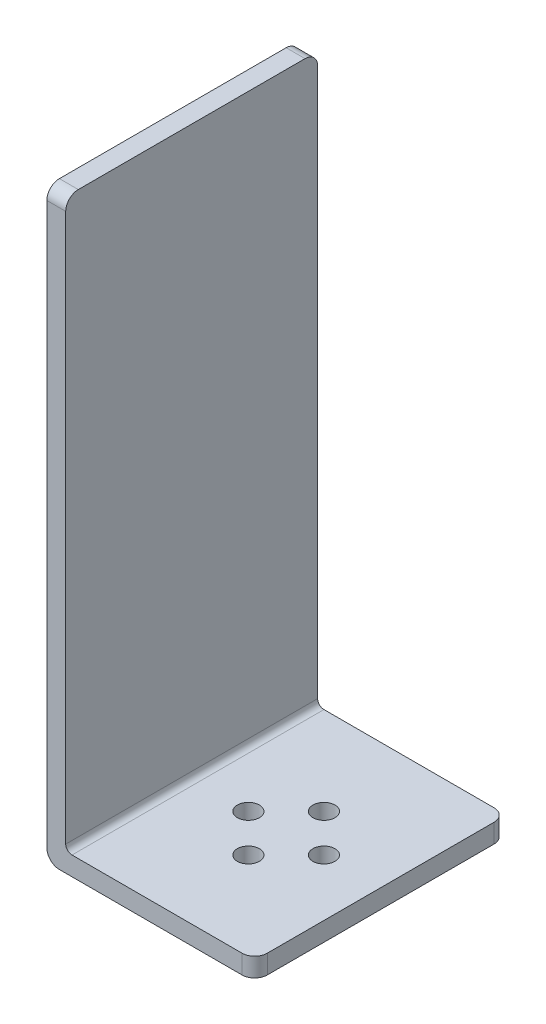
ISO-10303-21;
HEADER;
FILE_DESCRIPTION(('STEP AP214'),'2;1');
FILE_NAME('part.step','',(''),(''),'','','');
FILE_SCHEMA(('AUTOMOTIVE_DESIGN { 1 0 10303 214 1 1 1 1 }'));
ENDSEC;
DATA;
#1=APPLICATION_CONTEXT('core data for automotive mechanical design processes');
#2=APPLICATION_PROTOCOL_DEFINITION('international standard','automotive_design',2000,#1);
#3=PRODUCT_CONTEXT('',#1,'mechanical');
#4=PRODUCT('Part','Part','',(#3));
#5=PRODUCT_RELATED_PRODUCT_CATEGORY('part','',(#4));
#6=PRODUCT_DEFINITION_FORMATION('','',#4);
#7=PRODUCT_DEFINITION_CONTEXT('part definition',#1,'design');
#8=PRODUCT_DEFINITION('design','',#6,#7);
#9=PRODUCT_DEFINITION_SHAPE('','',#8);
#10=(LENGTH_UNIT() NAMED_UNIT(*) SI_UNIT(.MILLI.,.METRE.));
#11=(NAMED_UNIT(*) PLANE_ANGLE_UNIT() SI_UNIT($,.RADIAN.));
#12=(NAMED_UNIT(*) SI_UNIT($,.STERADIAN.) SOLID_ANGLE_UNIT());
#13=UNCERTAINTY_MEASURE_WITH_UNIT(LENGTH_MEASURE(1.E-05),#10,'distance_accuracy_value','');
#14=(GEOMETRIC_REPRESENTATION_CONTEXT(3) GLOBAL_UNCERTAINTY_ASSIGNED_CONTEXT((#13)) GLOBAL_UNIT_ASSIGNED_CONTEXT((#10,
#11,#12)) REPRESENTATION_CONTEXT('',''));
#15=CARTESIAN_POINT('',(0.,0.,0.));
#16=DIRECTION('',(0.,0.,1.));
#17=DIRECTION('',(1.,0.,0.));
#18=AXIS2_PLACEMENT_3D('',#15,#16,#17);
#19=CARTESIAN_POINT('',(0.,-3.,40.));
#20=DIRECTION('',(0.,1.,0.));
#21=DIRECTION('',(0.,0.,1.));
#22=AXIS2_PLACEMENT_3D('',#19,#20,#21);
#23=PLANE('',#22);
#24=CARTESIAN_POINT('',(9.,-3.,20.));
#25=DIRECTION('',(0.,1.,0.));
#26=DIRECTION('',(0.,0.,1.));
#27=AXIS2_PLACEMENT_3D('',#24,#25,#26);
#28=CIRCLE('',#27,1.75);
#29=CARTESIAN_POINT('',(9.,-3.,21.75));
#30=VERTEX_POINT('',#29);
#31=EDGE_CURVE('E299',#30,#30,#28,.T.);
#32=ORIENTED_EDGE('',*,*,#31,.T.);
#33=EDGE_LOOP('',(#32));
#34=FACE_BOUND('',#33,.T.);
#35=CARTESIAN_POINT('',(21.,-3.,20.));
#36=DIRECTION('',(0.,1.,0.));
#37=DIRECTION('',(0.,0.,1.));
#38=AXIS2_PLACEMENT_3D('',#35,#36,#37);
#39=CIRCLE('',#38,1.74999999999999);
#40=CARTESIAN_POINT('',(21.,-3.,21.75));
#41=VERTEX_POINT('',#40);
#42=EDGE_CURVE('E293',#41,#41,#39,.T.);
#43=ORIENTED_EDGE('',*,*,#42,.T.);
#44=EDGE_LOOP('',(#43));
#45=FACE_BOUND('',#44,.T.);
#46=CARTESIAN_POINT('',(15.,-3.,26.));
#47=DIRECTION('',(0.,1.,0.));
#48=DIRECTION('',(0.,0.,1.));
#49=AXIS2_PLACEMENT_3D('',#46,#47,#48);
#50=CIRCLE('',#49,1.74999999999999);
#51=CARTESIAN_POINT('',(15.,-3.,27.75));
#52=VERTEX_POINT('',#51);
#53=EDGE_CURVE('E287',#52,#52,#50,.T.);
#54=ORIENTED_EDGE('',*,*,#53,.T.);
#55=EDGE_LOOP('',(#54));
#56=FACE_BOUND('',#55,.T.);
#57=CARTESIAN_POINT('',(15.,-3.,14.));
#58=DIRECTION('',(0.,1.,0.));
#59=DIRECTION('',(0.,0.,1.));
#60=AXIS2_PLACEMENT_3D('',#57,#58,#59);
#61=CIRCLE('',#60,1.75);
#62=CARTESIAN_POINT('',(15.,-3.,15.75));
#63=VERTEX_POINT('',#62);
#64=EDGE_CURVE('E203',#63,#63,#61,.T.);
#65=ORIENTED_EDGE('',*,*,#64,.T.);
#66=EDGE_LOOP('',(#65));
#67=FACE_BOUND('',#66,.T.);
#68=DIRECTION('',(1.,0.,0.));
#69=VECTOR('',#68,1.);
#70=CARTESIAN_POINT('',(0.,-3.,0.));
#71=LINE('',#70,#69);
#72=CARTESIAN_POINT('',(-1.,-3.,0.));
#73=VERTEX_POINT('',#72);
#74=CARTESIAN_POINT('',(28.,-3.,0.));
#75=VERTEX_POINT('',#74);
#76=EDGE_CURVE('E198',#73,#75,#71,.T.);
#77=ORIENTED_EDGE('',*,*,#76,.T.);
#78=CARTESIAN_POINT('',(28.,-3.,2.));
#79=DIRECTION('',(0.,1.,0.));
#80=DIRECTION('',(0.,0.,1.));
#81=AXIS2_PLACEMENT_3D('',#78,#79,#80);
#82=CIRCLE('',#81,2.);
#83=CARTESIAN_POINT('',(30.,-3.,2.));
#84=VERTEX_POINT('',#83);
#85=EDGE_CURVE('E55',#75,#84,#82,.F.);
#86=ORIENTED_EDGE('',*,*,#85,.T.);
#87=DIRECTION('',(0.,0.,-1.));
#88=VECTOR('',#87,1.);
#89=CARTESIAN_POINT('',(30.,-3.,40.));
#90=LINE('',#89,#88);
#91=CARTESIAN_POINT('',(30.,-3.,38.));
#92=VERTEX_POINT('',#91);
#93=EDGE_CURVE('E149',#92,#84,#90,.T.);
#94=ORIENTED_EDGE('',*,*,#93,.F.);
#95=CARTESIAN_POINT('',(28.,-3.,38.));
#96=DIRECTION('',(0.,1.,0.));
#97=DIRECTION('',(0.,0.,1.));
#98=AXIS2_PLACEMENT_3D('',#95,#96,#97);
#99=CIRCLE('',#98,2.);
#100=CARTESIAN_POINT('',(28.,-3.,40.));
#101=VERTEX_POINT('',#100);
#102=EDGE_CURVE('E187',#92,#101,#99,.F.);
#103=ORIENTED_EDGE('',*,*,#102,.T.);
#104=DIRECTION('',(1.,0.,0.));
#105=VECTOR('',#104,1.);
#106=CARTESIAN_POINT('',(0.,-3.,40.));
#107=LINE('',#106,#105);
#108=CARTESIAN_POINT('',(-1.,-3.,40.));
#109=VERTEX_POINT('',#108);
#110=EDGE_CURVE('E214',#109,#101,#107,.T.);
#111=ORIENTED_EDGE('',*,*,#110,.F.);
#112=DIRECTION('',(0.,0.,-1.));
#113=VECTOR('',#112,1.);
#114=CARTESIAN_POINT('',(-1.,-3.,40.));
#115=LINE('',#114,#113);
#116=EDGE_CURVE('E157',#109,#73,#115,.T.);
#117=ORIENTED_EDGE('',*,*,#116,.T.);
#118=EDGE_LOOP('',(#77,#86,#94,#103,#111,#117));
#119=FACE_BOUND('',#118,.T.);
#120=ADVANCED_FACE('F33',(#34,#45,#56,#67,#119),#23,.F.);
#121=CARTESIAN_POINT('',(30.,0.,40.));
#122=DIRECTION('',(1.,0.,0.));
#123=DIRECTION('',(0.,0.,-1.));
#124=AXIS2_PLACEMENT_3D('',#121,#122,#123);
#125=PLANE('',#124);
#126=ORIENTED_EDGE('',*,*,#93,.T.);
#127=DIRECTION('',(0.,-1.,0.));
#128=VECTOR('',#127,1.);
#129=CARTESIAN_POINT('',(30.,0.,2.));
#130=LINE('',#129,#128);
#131=CARTESIAN_POINT('',(30.,0.,2.));
#132=VERTEX_POINT('',#131);
#133=EDGE_CURVE('E41',#84,#132,#130,.F.);
#134=ORIENTED_EDGE('',*,*,#133,.T.);
#135=DIRECTION('',(0.,0.,-1.));
#136=VECTOR('',#135,1.);
#137=CARTESIAN_POINT('',(30.,0.,40.));
#138=LINE('',#137,#136);
#139=CARTESIAN_POINT('',(30.,0.,38.));
#140=VERTEX_POINT('',#139);
#141=EDGE_CURVE('E152',#140,#132,#138,.T.);
#142=ORIENTED_EDGE('',*,*,#141,.F.);
#143=DIRECTION('',(0.,-1.,0.));
#144=VECTOR('',#143,1.);
#145=CARTESIAN_POINT('',(30.,-3.,38.));
#146=LINE('',#145,#144);
#147=EDGE_CURVE('E184',#140,#92,#146,.T.);
#148=ORIENTED_EDGE('',*,*,#147,.T.);
#149=EDGE_LOOP('',(#126,#134,#142,#148));
#150=FACE_BOUND('',#149,.T.);
#151=ADVANCED_FACE('F238',(#150),#125,.T.);
#152=CARTESIAN_POINT('',(0.,0.,40.));
#153=DIRECTION('',(0.,1.,0.));
#154=DIRECTION('',(0.,0.,1.));
#155=AXIS2_PLACEMENT_3D('',#152,#153,#154);
#156=PLANE('',#155);
#157=CARTESIAN_POINT('',(9.,0.,20.));
#158=DIRECTION('',(0.,1.,0.));
#159=DIRECTION('',(0.,0.,1.));
#160=AXIS2_PLACEMENT_3D('',#157,#158,#159);
#161=CIRCLE('',#160,1.75);
#162=CARTESIAN_POINT('',(9.,0.,21.75));
#163=VERTEX_POINT('',#162);
#164=EDGE_CURVE('E301',#163,#163,#161,.T.);
#165=ORIENTED_EDGE('',*,*,#164,.F.);
#166=EDGE_LOOP('',(#165));
#167=FACE_BOUND('',#166,.T.);
#168=CARTESIAN_POINT('',(21.,0.,20.));
#169=DIRECTION('',(0.,1.,0.));
#170=DIRECTION('',(0.,0.,1.));
#171=AXIS2_PLACEMENT_3D('',#168,#169,#170);
#172=CIRCLE('',#171,1.74999999999999);
#173=CARTESIAN_POINT('',(21.,0.,21.75));
#174=VERTEX_POINT('',#173);
#175=EDGE_CURVE('E296',#174,#174,#172,.T.);
#176=ORIENTED_EDGE('',*,*,#175,.F.);
#177=EDGE_LOOP('',(#176));
#178=FACE_BOUND('',#177,.T.);
#179=CARTESIAN_POINT('',(15.,0.,26.));
#180=DIRECTION('',(0.,1.,0.));
#181=DIRECTION('',(0.,0.,1.));
#182=AXIS2_PLACEMENT_3D('',#179,#180,#181);
#183=CIRCLE('',#182,1.74999999999999);
#184=CARTESIAN_POINT('',(15.,0.,27.75));
#185=VERTEX_POINT('',#184);
#186=EDGE_CURVE('E290',#185,#185,#183,.T.);
#187=ORIENTED_EDGE('',*,*,#186,.F.);
#188=EDGE_LOOP('',(#187));
#189=FACE_BOUND('',#188,.T.);
#190=CARTESIAN_POINT('',(15.,0.,14.));
#191=DIRECTION('',(0.,1.,0.));
#192=DIRECTION('',(0.,0.,1.));
#193=AXIS2_PLACEMENT_3D('',#190,#191,#192);
#194=CIRCLE('',#193,1.75);
#195=CARTESIAN_POINT('',(15.,0.,15.75));
#196=VERTEX_POINT('',#195);
#197=EDGE_CURVE('E207',#196,#196,#194,.T.);
#198=ORIENTED_EDGE('',*,*,#197,.F.);
#199=EDGE_LOOP('',(#198));
#200=FACE_BOUND('',#199,.T.);
#201=ORIENTED_EDGE('',*,*,#141,.T.);
#202=CARTESIAN_POINT('',(28.,0.,2.));
#203=DIRECTION('',(0.,1.,0.));
#204=DIRECTION('',(0.,0.,1.));
#205=AXIS2_PLACEMENT_3D('',#202,#203,#204);
#206=CIRCLE('',#205,2.);
#207=CARTESIAN_POINT('',(28.,0.,0.));
#208=VERTEX_POINT('',#207);
#209=EDGE_CURVE('E11',#132,#208,#206,.T.);
#210=ORIENTED_EDGE('',*,*,#209,.T.);
#211=DIRECTION('',(1.,0.,0.));
#212=VECTOR('',#211,1.);
#213=CARTESIAN_POINT('',(0.,0.,0.));
#214=LINE('',#213,#212);
#215=CARTESIAN_POINT('',(1.,0.,0.));
#216=VERTEX_POINT('',#215);
#217=EDGE_CURVE('E134',#216,#208,#214,.T.);
#218=ORIENTED_EDGE('',*,*,#217,.F.);
#219=DIRECTION('',(0.,0.,-1.));
#220=VECTOR('',#219,1.);
#221=CARTESIAN_POINT('',(1.,0.,40.));
#222=LINE('',#221,#220);
#223=CARTESIAN_POINT('',(1.,0.,40.));
#224=VERTEX_POINT('',#223);
#225=EDGE_CURVE('E142',#216,#224,#222,.F.);
#226=ORIENTED_EDGE('',*,*,#225,.T.);
#227=DIRECTION('',(1.,0.,0.));
#228=VECTOR('',#227,1.);
#229=CARTESIAN_POINT('',(0.,0.,40.));
#230=LINE('',#229,#228);
#231=CARTESIAN_POINT('',(28.,0.,40.));
#232=VERTEX_POINT('',#231);
#233=EDGE_CURVE('E281',#224,#232,#230,.T.);
#234=ORIENTED_EDGE('',*,*,#233,.T.);
#235=CARTESIAN_POINT('',(28.,0.,38.));
#236=DIRECTION('',(0.,1.,0.));
#237=DIRECTION('',(0.,0.,1.));
#238=AXIS2_PLACEMENT_3D('',#235,#236,#237);
#239=CIRCLE('',#238,2.);
#240=EDGE_CURVE('E191',#232,#140,#239,.T.);
#241=ORIENTED_EDGE('',*,*,#240,.T.);
#242=EDGE_LOOP('',(#201,#210,#218,#226,#234,#241));
#243=FACE_BOUND('',#242,.T.);
#244=ADVANCED_FACE('F221',(#167,#178,#189,#200,#243),#156,.T.);
#245=CARTESIAN_POINT('',(0.,0.,40.));
#246=DIRECTION('',(1.,0.,0.));
#247=DIRECTION('',(0.,0.,-1.));
#248=AXIS2_PLACEMENT_3D('',#245,#246,#247);
#249=PLANE('',#248);
#250=DIRECTION('',(0.,-1.,0.));
#251=VECTOR('',#250,1.);
#252=CARTESIAN_POINT('',(0.,0.,0.));
#253=LINE('',#252,#251);
#254=CARTESIAN_POINT('',(0.,88.,0.));
#255=VERTEX_POINT('',#254);
#256=CARTESIAN_POINT('',(0.,1.,0.));
#257=VERTEX_POINT('',#256);
#258=EDGE_CURVE('E122',#255,#257,#253,.T.);
#259=ORIENTED_EDGE('',*,*,#258,.F.);
#260=CARTESIAN_POINT('',(0.,88.,2.));
#261=DIRECTION('',(1.,0.,0.));
#262=DIRECTION('',(0.,0.,-1.));
#263=AXIS2_PLACEMENT_3D('',#260,#261,#262);
#264=CIRCLE('',#263,2.);
#265=CARTESIAN_POINT('',(0.,90.,2.));
#266=VERTEX_POINT('',#265);
#267=EDGE_CURVE('E178',#255,#266,#264,.T.);
#268=ORIENTED_EDGE('',*,*,#267,.T.);
#269=DIRECTION('',(0.,0.,-1.));
#270=VECTOR('',#269,1.);
#271=CARTESIAN_POINT('',(0.,90.,40.));
#272=LINE('',#271,#270);
#273=CARTESIAN_POINT('',(0.,90.,38.));
#274=VERTEX_POINT('',#273);
#275=EDGE_CURVE('E218',#274,#266,#272,.T.);
#276=ORIENTED_EDGE('',*,*,#275,.F.);
#277=CARTESIAN_POINT('',(0.,88.,38.));
#278=DIRECTION('',(1.,0.,0.));
#279=DIRECTION('',(0.,0.,-1.));
#280=AXIS2_PLACEMENT_3D('',#277,#278,#279);
#281=CIRCLE('',#280,2.);
#282=CARTESIAN_POINT('',(0.,88.,40.));
#283=VERTEX_POINT('',#282);
#284=EDGE_CURVE('E171',#274,#283,#281,.T.);
#285=ORIENTED_EDGE('',*,*,#284,.T.);
#286=DIRECTION('',(0.,-1.,0.));
#287=VECTOR('',#286,1.);
#288=CARTESIAN_POINT('',(0.,0.,40.));
#289=LINE('',#288,#287);
#290=CARTESIAN_POINT('',(0.,1.,40.));
#291=VERTEX_POINT('',#290);
#292=EDGE_CURVE('E147',#283,#291,#289,.T.);
#293=ORIENTED_EDGE('',*,*,#292,.T.);
#294=DIRECTION('',(0.,0.,-1.));
#295=VECTOR('',#294,1.);
#296=CARTESIAN_POINT('',(0.,1.,0.));
#297=LINE('',#296,#295);
#298=EDGE_CURVE('E141',#291,#257,#297,.T.);
#299=ORIENTED_EDGE('',*,*,#298,.T.);
#300=EDGE_LOOP('',(#259,#268,#276,#285,#293,#299));
#301=FACE_BOUND('',#300,.T.);
#302=ADVANCED_FACE('F145',(#301),#249,.T.);
#303=CARTESIAN_POINT('',(-3.,90.,40.));
#304=DIRECTION('',(0.,1.,0.));
#305=DIRECTION('',(0.,0.,1.));
#306=AXIS2_PLACEMENT_3D('',#303,#304,#305);
#307=PLANE('',#306);
#308=ORIENTED_EDGE('',*,*,#275,.T.);
#309=DIRECTION('',(1.,0.,0.));
#310=VECTOR('',#309,1.);
#311=CARTESIAN_POINT('',(-3.,90.,2.));
#312=LINE('',#311,#310);
#313=CARTESIAN_POINT('',(-3.,90.,2.));
#314=VERTEX_POINT('',#313);
#315=EDGE_CURVE('E180',#266,#314,#312,.F.);
#316=ORIENTED_EDGE('',*,*,#315,.T.);
#317=DIRECTION('',(0.,0.,-1.));
#318=VECTOR('',#317,1.);
#319=CARTESIAN_POINT('',(-3.,90.,40.));
#320=LINE('',#319,#318);
#321=CARTESIAN_POINT('',(-3.,90.,38.));
#322=VERTEX_POINT('',#321);
#323=EDGE_CURVE('E215',#322,#314,#320,.T.);
#324=ORIENTED_EDGE('',*,*,#323,.F.);
#325=DIRECTION('',(1.,0.,0.));
#326=VECTOR('',#325,1.);
#327=CARTESIAN_POINT('',(0.,90.,38.));
#328=LINE('',#327,#326);
#329=EDGE_CURVE('E168',#322,#274,#328,.T.);
#330=ORIENTED_EDGE('',*,*,#329,.T.);
#331=EDGE_LOOP('',(#308,#316,#324,#330));
#332=FACE_BOUND('',#331,.T.);
#333=ADVANCED_FACE('F277',(#332),#307,.T.);
#334=CARTESIAN_POINT('',(-3.,0.,40.));
#335=DIRECTION('',(1.,0.,0.));
#336=DIRECTION('',(0.,0.,-1.));
#337=AXIS2_PLACEMENT_3D('',#334,#335,#336);
#338=PLANE('',#337);
#339=ORIENTED_EDGE('',*,*,#323,.T.);
#340=CARTESIAN_POINT('',(-3.,88.,2.));
#341=DIRECTION('',(1.,0.,0.));
#342=DIRECTION('',(0.,0.,-1.));
#343=AXIS2_PLACEMENT_3D('',#340,#341,#342);
#344=CIRCLE('',#343,2.);
#345=CARTESIAN_POINT('',(-3.,88.,0.));
#346=VERTEX_POINT('',#345);
#347=EDGE_CURVE('E182',#314,#346,#344,.F.);
#348=ORIENTED_EDGE('',*,*,#347,.T.);
#349=DIRECTION('',(0.,1.,0.));
#350=VECTOR('',#349,1.);
#351=CARTESIAN_POINT('',(-3.,0.,0.));
#352=LINE('',#351,#350);
#353=CARTESIAN_POINT('',(-3.,-1.,0.));
#354=VERTEX_POINT('',#353);
#355=EDGE_CURVE('E133',#346,#354,#352,.F.);
#356=ORIENTED_EDGE('',*,*,#355,.T.);
#357=DIRECTION('',(0.,0.,-1.));
#358=VECTOR('',#357,1.);
#359=CARTESIAN_POINT('',(-3.,-1.,40.));
#360=LINE('',#359,#358);
#361=CARTESIAN_POINT('',(-3.,-1.,40.));
#362=VERTEX_POINT('',#361);
#363=EDGE_CURVE('E163',#354,#362,#360,.F.);
#364=ORIENTED_EDGE('',*,*,#363,.T.);
#365=DIRECTION('',(0.,1.,0.));
#366=VECTOR('',#365,1.);
#367=CARTESIAN_POINT('',(-3.,0.,40.));
#368=LINE('',#367,#366);
#369=CARTESIAN_POINT('',(-3.,88.,40.));
#370=VERTEX_POINT('',#369);
#371=EDGE_CURVE('E210',#370,#362,#368,.F.);
#372=ORIENTED_EDGE('',*,*,#371,.F.);
#373=CARTESIAN_POINT('',(-3.,88.,38.));
#374=DIRECTION('',(1.,0.,0.));
#375=DIRECTION('',(0.,0.,-1.));
#376=AXIS2_PLACEMENT_3D('',#373,#374,#375);
#377=CIRCLE('',#376,2.);
#378=EDGE_CURVE('E175',#370,#322,#377,.F.);
#379=ORIENTED_EDGE('',*,*,#378,.T.);
#380=EDGE_LOOP('',(#339,#348,#356,#364,#372,#379));
#381=FACE_BOUND('',#380,.T.);
#382=ADVANCED_FACE('F266',(#381),#338,.F.);
#383=CARTESIAN_POINT('',(0.,0.,40.));
#384=DIRECTION('',(0.,0.,-1.));
#385=DIRECTION('',(-1.,0.,0.));
#386=AXIS2_PLACEMENT_3D('',#383,#384,#385);
#387=PLANE('',#386);
#388=ORIENTED_EDGE('',*,*,#110,.T.);
#389=DIRECTION('',(0.,-1.,0.));
#390=VECTOR('',#389,1.);
#391=CARTESIAN_POINT('',(28.,0.,40.));
#392=LINE('',#391,#390);
#393=EDGE_CURVE('E189',#101,#232,#392,.F.);
#394=ORIENTED_EDGE('',*,*,#393,.T.);
#395=ORIENTED_EDGE('',*,*,#233,.F.);
#396=CARTESIAN_POINT('',(1.,1.,40.));
#397=DIRECTION('',(0.,0.,-1.));
#398=DIRECTION('',(-1.,0.,0.));
#399=AXIS2_PLACEMENT_3D('',#396,#397,#398);
#400=CIRCLE('',#399,1.);
#401=EDGE_CURVE('E143',#224,#291,#400,.T.);
#402=ORIENTED_EDGE('',*,*,#401,.T.);
#403=ORIENTED_EDGE('',*,*,#292,.F.);
#404=DIRECTION('',(1.,0.,0.));
#405=VECTOR('',#404,1.);
#406=CARTESIAN_POINT('',(-3.,88.,40.));
#407=LINE('',#406,#405);
#408=EDGE_CURVE('E173',#283,#370,#407,.F.);
#409=ORIENTED_EDGE('',*,*,#408,.T.);
#410=ORIENTED_EDGE('',*,*,#371,.T.);
#411=CARTESIAN_POINT('',(-1.,-1.,40.));
#412=DIRECTION('',(0.,0.,-1.));
#413=DIRECTION('',(-1.,0.,0.));
#414=AXIS2_PLACEMENT_3D('',#411,#412,#413);
#415=CIRCLE('',#414,2.);
#416=EDGE_CURVE('E166',#362,#109,#415,.F.);
#417=ORIENTED_EDGE('',*,*,#416,.T.);
#418=EDGE_LOOP('',(#388,#394,#395,#402,#403,#409,#410,#417));
#419=FACE_BOUND('',#418,.T.);
#420=ADVANCED_FACE('F279',(#419),#387,.F.);
#421=CARTESIAN_POINT('',(0.,0.,0.));
#422=DIRECTION('',(0.,0.,-1.));
#423=DIRECTION('',(-1.,0.,0.));
#424=AXIS2_PLACEMENT_3D('',#421,#422,#423);
#425=PLANE('',#424);
#426=ORIENTED_EDGE('',*,*,#217,.T.);
#427=DIRECTION('',(0.,-1.,0.));
#428=VECTOR('',#427,1.);
#429=CARTESIAN_POINT('',(28.,0.,0.));
#430=LINE('',#429,#428);
#431=EDGE_CURVE('E193',#208,#75,#430,.T.);
#432=ORIENTED_EDGE('',*,*,#431,.T.);
#433=ORIENTED_EDGE('',*,*,#76,.F.);
#434=CARTESIAN_POINT('',(-1.,-1.,0.));
#435=DIRECTION('',(0.,0.,-1.));
#436=DIRECTION('',(-1.,0.,0.));
#437=AXIS2_PLACEMENT_3D('',#434,#435,#436);
#438=CIRCLE('',#437,2.);
#439=EDGE_CURVE('E160',#73,#354,#438,.T.);
#440=ORIENTED_EDGE('',*,*,#439,.T.);
#441=ORIENTED_EDGE('',*,*,#355,.F.);
#442=DIRECTION('',(1.,0.,0.));
#443=VECTOR('',#442,1.);
#444=CARTESIAN_POINT('',(0.,88.,0.));
#445=LINE('',#444,#443);
#446=EDGE_CURVE('E130',#346,#255,#445,.T.);
#447=ORIENTED_EDGE('',*,*,#446,.T.);
#448=ORIENTED_EDGE('',*,*,#258,.T.);
#449=CARTESIAN_POINT('',(1.,1.,0.));
#450=DIRECTION('',(0.,0.,-1.));
#451=DIRECTION('',(-1.,0.,0.));
#452=AXIS2_PLACEMENT_3D('',#449,#450,#451);
#453=CIRCLE('',#452,1.);
#454=EDGE_CURVE('E126',#257,#216,#453,.F.);
#455=ORIENTED_EDGE('',*,*,#454,.T.);
#456=EDGE_LOOP('',(#426,#432,#433,#440,#441,#447,#448,#455));
#457=FACE_BOUND('',#456,.T.);
#458=ADVANCED_FACE('F125',(#457),#425,.T.);
#459=CARTESIAN_POINT('',(1.,1.,40.));
#460=DIRECTION('',(0.,0.,1.));
#461=DIRECTION('',(1.,0.,0.));
#462=AXIS2_PLACEMENT_3D('',#459,#460,#461);
#463=CYLINDRICAL_SURFACE('',#462,1.);
#464=ORIENTED_EDGE('',*,*,#401,.F.);
#465=ORIENTED_EDGE('',*,*,#225,.F.);
#466=ORIENTED_EDGE('',*,*,#454,.F.);
#467=ORIENTED_EDGE('',*,*,#298,.F.);
#468=EDGE_LOOP('',(#464,#465,#466,#467));
#469=FACE_BOUND('',#468,.T.);
#470=ADVANCED_FACE('F140',(#469),#463,.F.);
#471=CARTESIAN_POINT('',(-1.,-1.,40.));
#472=DIRECTION('',(0.,0.,-1.));
#473=DIRECTION('',(-1.,0.,0.));
#474=AXIS2_PLACEMENT_3D('',#471,#472,#473);
#475=CYLINDRICAL_SURFACE('',#474,2.);
#476=ORIENTED_EDGE('',*,*,#416,.F.);
#477=ORIENTED_EDGE('',*,*,#363,.F.);
#478=ORIENTED_EDGE('',*,*,#439,.F.);
#479=ORIENTED_EDGE('',*,*,#116,.F.);
#480=EDGE_LOOP('',(#476,#477,#478,#479));
#481=FACE_BOUND('',#480,.T.);
#482=ADVANCED_FACE('F251',(#481),#475,.T.);
#483=CARTESIAN_POINT('',(-3.,88.,38.));
#484=DIRECTION('',(-1.,0.,0.));
#485=DIRECTION('',(0.,0.,1.));
#486=AXIS2_PLACEMENT_3D('',#483,#484,#485);
#487=CYLINDRICAL_SURFACE('',#486,2.);
#488=ORIENTED_EDGE('',*,*,#378,.F.);
#489=ORIENTED_EDGE('',*,*,#408,.F.);
#490=ORIENTED_EDGE('',*,*,#284,.F.);
#491=ORIENTED_EDGE('',*,*,#329,.F.);
#492=EDGE_LOOP('',(#488,#489,#490,#491));
#493=FACE_BOUND('',#492,.T.);
#494=ADVANCED_FACE('F254',(#493),#487,.T.);
#495=CARTESIAN_POINT('',(0.,88.,2.));
#496=DIRECTION('',(1.,0.,0.));
#497=DIRECTION('',(0.,0.,-1.));
#498=AXIS2_PLACEMENT_3D('',#495,#496,#497);
#499=CYLINDRICAL_SURFACE('',#498,2.);
#500=ORIENTED_EDGE('',*,*,#347,.F.);
#501=ORIENTED_EDGE('',*,*,#315,.F.);
#502=ORIENTED_EDGE('',*,*,#267,.F.);
#503=ORIENTED_EDGE('',*,*,#446,.F.);
#504=EDGE_LOOP('',(#500,#501,#502,#503));
#505=FACE_BOUND('',#504,.T.);
#506=ADVANCED_FACE('F235',(#505),#499,.T.);
#507=CARTESIAN_POINT('',(28.,0.,38.));
#508=DIRECTION('',(0.,1.,0.));
#509=DIRECTION('',(0.,0.,1.));
#510=AXIS2_PLACEMENT_3D('',#507,#508,#509);
#511=CYLINDRICAL_SURFACE('',#510,2.);
#512=ORIENTED_EDGE('',*,*,#240,.F.);
#513=ORIENTED_EDGE('',*,*,#393,.F.);
#514=ORIENTED_EDGE('',*,*,#102,.F.);
#515=ORIENTED_EDGE('',*,*,#147,.F.);
#516=EDGE_LOOP('',(#512,#513,#514,#515));
#517=FACE_BOUND('',#516,.T.);
#518=ADVANCED_FACE('F227',(#517),#511,.T.);
#519=CARTESIAN_POINT('',(28.,0.,2.));
#520=DIRECTION('',(0.,-1.,0.));
#521=DIRECTION('',(0.,0.,-1.));
#522=AXIS2_PLACEMENT_3D('',#519,#520,#521);
#523=CYLINDRICAL_SURFACE('',#522,2.);
#524=ORIENTED_EDGE('',*,*,#209,.F.);
#525=ORIENTED_EDGE('',*,*,#133,.F.);
#526=ORIENTED_EDGE('',*,*,#85,.F.);
#527=ORIENTED_EDGE('',*,*,#431,.F.);
#528=EDGE_LOOP('',(#524,#525,#526,#527));
#529=FACE_BOUND('',#528,.T.);
#530=ADVANCED_FACE('F35',(#529),#523,.T.);
#531=CARTESIAN_POINT('',(15.,-10.,14.));
#532=DIRECTION('',(0.,1.,0.));
#533=DIRECTION('',(0.,0.,1.));
#534=AXIS2_PLACEMENT_3D('',#531,#532,#533);
#535=CYLINDRICAL_SURFACE('',#534,1.75);
#536=ORIENTED_EDGE('',*,*,#197,.T.);
#537=EDGE_LOOP('',(#536));
#538=FACE_BOUND('',#537,.T.);
#539=ORIENTED_EDGE('',*,*,#64,.F.);
#540=EDGE_LOOP('',(#539));
#541=FACE_BOUND('',#540,.T.);
#542=ADVANCED_FACE('F226',(#538,#541),#535,.F.);
#543=CARTESIAN_POINT('',(15.,-10.,26.));
#544=DIRECTION('',(0.,1.,0.));
#545=DIRECTION('',(0.,0.,1.));
#546=AXIS2_PLACEMENT_3D('',#543,#544,#545);
#547=CYLINDRICAL_SURFACE('',#546,1.74999999999999);
#548=ORIENTED_EDGE('',*,*,#186,.T.);
#549=EDGE_LOOP('',(#548));
#550=FACE_BOUND('',#549,.T.);
#551=ORIENTED_EDGE('',*,*,#53,.F.);
#552=EDGE_LOOP('',(#551));
#553=FACE_BOUND('',#552,.T.);
#554=ADVANCED_FACE('F232',(#550,#553),#547,.F.);
#555=CARTESIAN_POINT('',(21.,-10.,20.));
#556=DIRECTION('',(0.,1.,0.));
#557=DIRECTION('',(0.,0.,1.));
#558=AXIS2_PLACEMENT_3D('',#555,#556,#557);
#559=CYLINDRICAL_SURFACE('',#558,1.74999999999999);
#560=ORIENTED_EDGE('',*,*,#175,.T.);
#561=EDGE_LOOP('',(#560));
#562=FACE_BOUND('',#561,.T.);
#563=ORIENTED_EDGE('',*,*,#42,.F.);
#564=EDGE_LOOP('',(#563));
#565=FACE_BOUND('',#564,.T.);
#566=ADVANCED_FACE('F321',(#562,#565),#559,.F.);
#567=CARTESIAN_POINT('',(9.,-10.,20.));
#568=DIRECTION('',(0.,1.,0.));
#569=DIRECTION('',(0.,0.,1.));
#570=AXIS2_PLACEMENT_3D('',#567,#568,#569);
#571=CYLINDRICAL_SURFACE('',#570,1.75);
#572=ORIENTED_EDGE('',*,*,#164,.T.);
#573=EDGE_LOOP('',(#572));
#574=FACE_BOUND('',#573,.T.);
#575=ORIENTED_EDGE('',*,*,#31,.F.);
#576=EDGE_LOOP('',(#575));
#577=FACE_BOUND('',#576,.T.);
#578=ADVANCED_FACE('F305',(#574,#577),#571,.F.);
#579=CLOSED_SHELL('',(#120,#151,#244,#302,#333,#382,#420,#458,#470,#482,#494,#506,#518,#530,
#542,#554,#566,#578));
#580=MANIFOLD_SOLID_BREP('B2',#579);
#581=ADVANCED_BREP_SHAPE_REPRESENTATION('',(#18,#580),#14);
#582=SHAPE_DEFINITION_REPRESENTATION(#9,#581);
ENDSEC;
END-ISO-10303-21;
